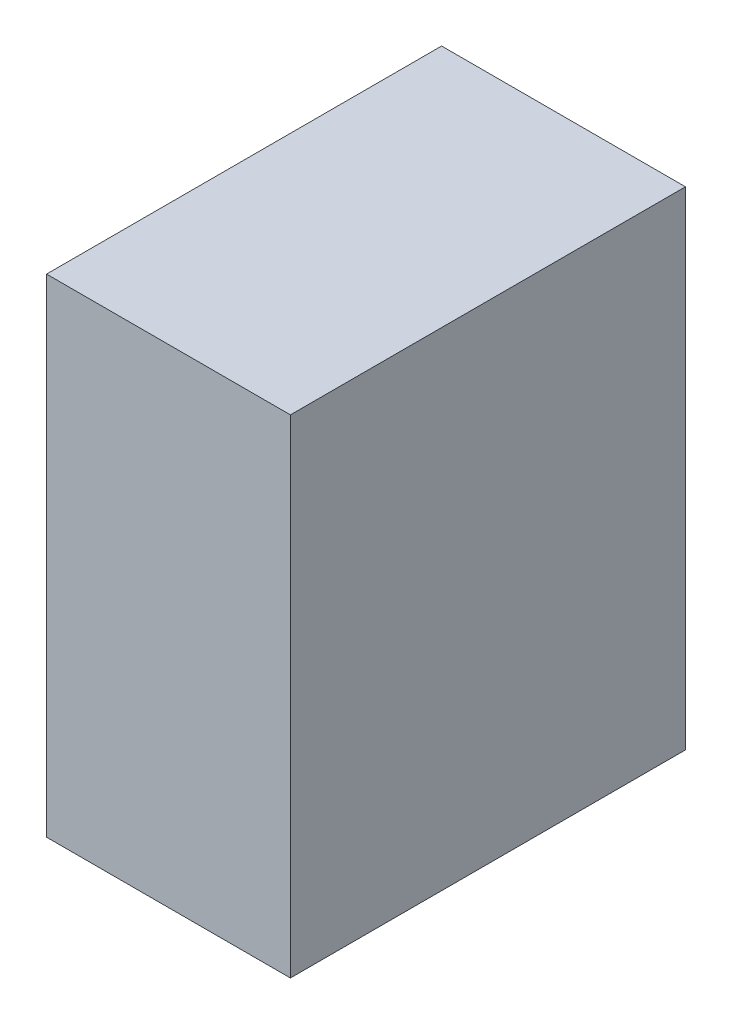
ISO-10303-21;
HEADER;
FILE_DESCRIPTION(('STEP AP214'),'2;1');
FILE_NAME('part.step','',(''),(''),'','','');
FILE_SCHEMA(('AUTOMOTIVE_DESIGN { 1 0 10303 214 1 1 1 1 }'));
ENDSEC;
DATA;
#1=APPLICATION_CONTEXT('core data for automotive mechanical design processes');
#2=APPLICATION_PROTOCOL_DEFINITION('international standard','automotive_design',2000,#1);
#3=PRODUCT_CONTEXT('',#1,'mechanical');
#4=PRODUCT('Part','Part','',(#3));
#5=PRODUCT_RELATED_PRODUCT_CATEGORY('part','',(#4));
#6=PRODUCT_DEFINITION_FORMATION('','',#4);
#7=PRODUCT_DEFINITION_CONTEXT('part definition',#1,'design');
#8=PRODUCT_DEFINITION('design','',#6,#7);
#9=PRODUCT_DEFINITION_SHAPE('','',#8);
#10=(LENGTH_UNIT() NAMED_UNIT(*) SI_UNIT(.MILLI.,.METRE.));
#11=(NAMED_UNIT(*) PLANE_ANGLE_UNIT() SI_UNIT($,.RADIAN.));
#12=(NAMED_UNIT(*) SI_UNIT($,.STERADIAN.) SOLID_ANGLE_UNIT());
#13=UNCERTAINTY_MEASURE_WITH_UNIT(LENGTH_MEASURE(1.E-05),#10,'distance_accuracy_value','');
#14=(GEOMETRIC_REPRESENTATION_CONTEXT(3) GLOBAL_UNCERTAINTY_ASSIGNED_CONTEXT((#13)) GLOBAL_UNIT_ASSIGNED_CONTEXT((#10,
#11,#12)) REPRESENTATION_CONTEXT('',''));
#15=CARTESIAN_POINT('',(0.,0.,0.));
#16=DIRECTION('',(0.,0.,1.));
#17=DIRECTION('',(1.,0.,0.));
#18=AXIS2_PLACEMENT_3D('',#15,#16,#17);
#19=CARTESIAN_POINT('',(-10.,0.,0.));
#20=DIRECTION('',(0.,0.,1.));
#21=DIRECTION('',(1.,0.,0.));
#22=AXIS2_PLACEMENT_3D('',#19,#20,#21);
#23=PLANE('',#22);
#24=DIRECTION('',(0.,-1.,0.));
#25=VECTOR('',#24,1.);
#26=CARTESIAN_POINT('',(0.,0.,0.));
#27=LINE('',#26,#25);
#28=CARTESIAN_POINT('',(0.,20.,0.));
#29=VERTEX_POINT('',#28);
#30=CARTESIAN_POINT('',(0.,0.,0.));
#31=VERTEX_POINT('',#30);
#32=EDGE_CURVE('E107',#29,#31,#27,.T.);
#33=ORIENTED_EDGE('',*,*,#32,.F.);
#34=DIRECTION('',(1.,0.,0.));
#35=VECTOR('',#34,1.);
#36=CARTESIAN_POINT('',(-10.,20.,0.));
#37=LINE('',#36,#35);
#38=CARTESIAN_POINT('',(-10.,20.,0.));
#39=VERTEX_POINT('',#38);
#40=EDGE_CURVE('E11',#39,#29,#37,.T.);
#41=ORIENTED_EDGE('',*,*,#40,.F.);
#42=DIRECTION('',(0.,-1.,0.));
#43=VECTOR('',#42,1.);
#44=CARTESIAN_POINT('',(-10.,0.,0.));
#45=LINE('',#44,#43);
#46=CARTESIAN_POINT('',(-10.,0.,0.));
#47=VERTEX_POINT('',#46);
#48=EDGE_CURVE('E102',#39,#47,#45,.T.);
#49=ORIENTED_EDGE('',*,*,#48,.T.);
#50=DIRECTION('',(1.,0.,0.));
#51=VECTOR('',#50,1.);
#52=CARTESIAN_POINT('',(-10.,0.,0.));
#53=LINE('',#52,#51);
#54=EDGE_CURVE('E46',#47,#31,#53,.T.);
#55=ORIENTED_EDGE('',*,*,#54,.T.);
#56=EDGE_LOOP('',(#33,#41,#49,#55));
#57=FACE_BOUND('',#56,.T.);
#58=ADVANCED_FACE('F43',(#57),#23,.T.);
#59=CARTESIAN_POINT('',(-10.,20.,0.));
#60=DIRECTION('',(0.,1.,0.));
#61=DIRECTION('',(0.,0.,1.));
#62=AXIS2_PLACEMENT_3D('',#59,#60,#61);
#63=PLANE('',#62);
#64=DIRECTION('',(0.,0.,1.));
#65=VECTOR('',#64,1.);
#66=CARTESIAN_POINT('',(0.,20.,0.));
#67=LINE('',#66,#65);
#68=CARTESIAN_POINT('',(0.,20.,-16.2));
#69=VERTEX_POINT('',#68);
#70=EDGE_CURVE('E104',#69,#29,#67,.T.);
#71=ORIENTED_EDGE('',*,*,#70,.F.);
#72=DIRECTION('',(1.,0.,0.));
#73=VECTOR('',#72,1.);
#74=CARTESIAN_POINT('',(-10.,20.,-16.2));
#75=LINE('',#74,#73);
#76=CARTESIAN_POINT('',(-10.,20.,-16.2));
#77=VERTEX_POINT('',#76);
#78=EDGE_CURVE('E55',#77,#69,#75,.T.);
#79=ORIENTED_EDGE('',*,*,#78,.F.);
#80=DIRECTION('',(0.,0.,1.));
#81=VECTOR('',#80,1.);
#82=CARTESIAN_POINT('',(-10.,20.,0.));
#83=LINE('',#82,#81);
#84=EDGE_CURVE('E97',#77,#39,#83,.T.);
#85=ORIENTED_EDGE('',*,*,#84,.T.);
#86=ORIENTED_EDGE('',*,*,#40,.T.);
#87=EDGE_LOOP('',(#71,#79,#85,#86));
#88=FACE_BOUND('',#87,.T.);
#89=ADVANCED_FACE('F117',(#88),#63,.T.);
#90=CARTESIAN_POINT('',(-10.,0.,-16.2));
#91=DIRECTION('',(0.,0.,-1.));
#92=DIRECTION('',(-1.,0.,0.));
#93=AXIS2_PLACEMENT_3D('',#90,#91,#92);
#94=PLANE('',#93);
#95=DIRECTION('',(0.,1.,0.));
#96=VECTOR('',#95,1.);
#97=CARTESIAN_POINT('',(0.,0.,-16.2));
#98=LINE('',#97,#96);
#99=CARTESIAN_POINT('',(0.,0.,-16.2));
#100=VERTEX_POINT('',#99);
#101=EDGE_CURVE('E93',#100,#69,#98,.T.);
#102=ORIENTED_EDGE('',*,*,#101,.F.);
#103=DIRECTION('',(1.,0.,0.));
#104=VECTOR('',#103,1.);
#105=CARTESIAN_POINT('',(-10.,0.,-16.2));
#106=LINE('',#105,#104);
#107=CARTESIAN_POINT('',(-10.,0.,-16.2));
#108=VERTEX_POINT('',#107);
#109=EDGE_CURVE('E88',#108,#100,#106,.T.);
#110=ORIENTED_EDGE('',*,*,#109,.F.);
#111=DIRECTION('',(0.,1.,0.));
#112=VECTOR('',#111,1.);
#113=CARTESIAN_POINT('',(-10.,0.,-16.2));
#114=LINE('',#113,#112);
#115=EDGE_CURVE('E91',#108,#77,#114,.T.);
#116=ORIENTED_EDGE('',*,*,#115,.T.);
#117=ORIENTED_EDGE('',*,*,#78,.T.);
#118=EDGE_LOOP('',(#102,#110,#116,#117));
#119=FACE_BOUND('',#118,.T.);
#120=ADVANCED_FACE('F89',(#119),#94,.T.);
#121=CARTESIAN_POINT('',(-10.,0.,0.));
#122=DIRECTION('',(0.,-1.,0.));
#123=DIRECTION('',(0.,0.,-1.));
#124=AXIS2_PLACEMENT_3D('',#121,#122,#123);
#125=PLANE('',#124);
#126=DIRECTION('',(0.,0.,-1.));
#127=VECTOR('',#126,1.);
#128=CARTESIAN_POINT('',(0.,0.,0.));
#129=LINE('',#128,#127);
#130=EDGE_CURVE('E110',#31,#100,#129,.T.);
#131=ORIENTED_EDGE('',*,*,#130,.F.);
#132=ORIENTED_EDGE('',*,*,#54,.F.);
#133=DIRECTION('',(0.,0.,-1.));
#134=VECTOR('',#133,1.);
#135=CARTESIAN_POINT('',(-10.,0.,0.));
#136=LINE('',#135,#134);
#137=EDGE_CURVE('E100',#47,#108,#136,.T.);
#138=ORIENTED_EDGE('',*,*,#137,.T.);
#139=ORIENTED_EDGE('',*,*,#109,.T.);
#140=EDGE_LOOP('',(#131,#132,#138,#139));
#141=FACE_BOUND('',#140,.T.);
#142=ADVANCED_FACE('F99',(#141),#125,.T.);
#143=CARTESIAN_POINT('',(-10.,0.,0.));
#144=DIRECTION('',(-1.,0.,0.));
#145=DIRECTION('',(0.,0.,1.));
#146=AXIS2_PLACEMENT_3D('',#143,#144,#145);
#147=PLANE('',#146);
#148=ORIENTED_EDGE('',*,*,#48,.F.);
#149=ORIENTED_EDGE('',*,*,#84,.F.);
#150=ORIENTED_EDGE('',*,*,#115,.F.);
#151=ORIENTED_EDGE('',*,*,#137,.F.);
#152=EDGE_LOOP('',(#148,#149,#150,#151));
#153=FACE_BOUND('',#152,.T.);
#154=ADVANCED_FACE('F96',(#153),#147,.T.);
#155=CARTESIAN_POINT('',(0.,0.,0.));
#156=DIRECTION('',(-1.,0.,0.));
#157=DIRECTION('',(0.,0.,1.));
#158=AXIS2_PLACEMENT_3D('',#155,#156,#157);
#159=PLANE('',#158);
#160=ORIENTED_EDGE('',*,*,#32,.T.);
#161=ORIENTED_EDGE('',*,*,#130,.T.);
#162=ORIENTED_EDGE('',*,*,#101,.T.);
#163=ORIENTED_EDGE('',*,*,#70,.T.);
#164=EDGE_LOOP('',(#160,#161,#162,#163));
#165=FACE_BOUND('',#164,.T.);
#166=ADVANCED_FACE('F116',(#165),#159,.F.);
#167=CLOSED_SHELL('',(#58,#89,#120,#142,#154,#166));
#168=MANIFOLD_SOLID_BREP('B2',#167);
#169=ADVANCED_BREP_SHAPE_REPRESENTATION('',(#18,#168),#14);
#170=SHAPE_DEFINITION_REPRESENTATION(#9,#169);
ENDSEC;
END-ISO-10303-21;
